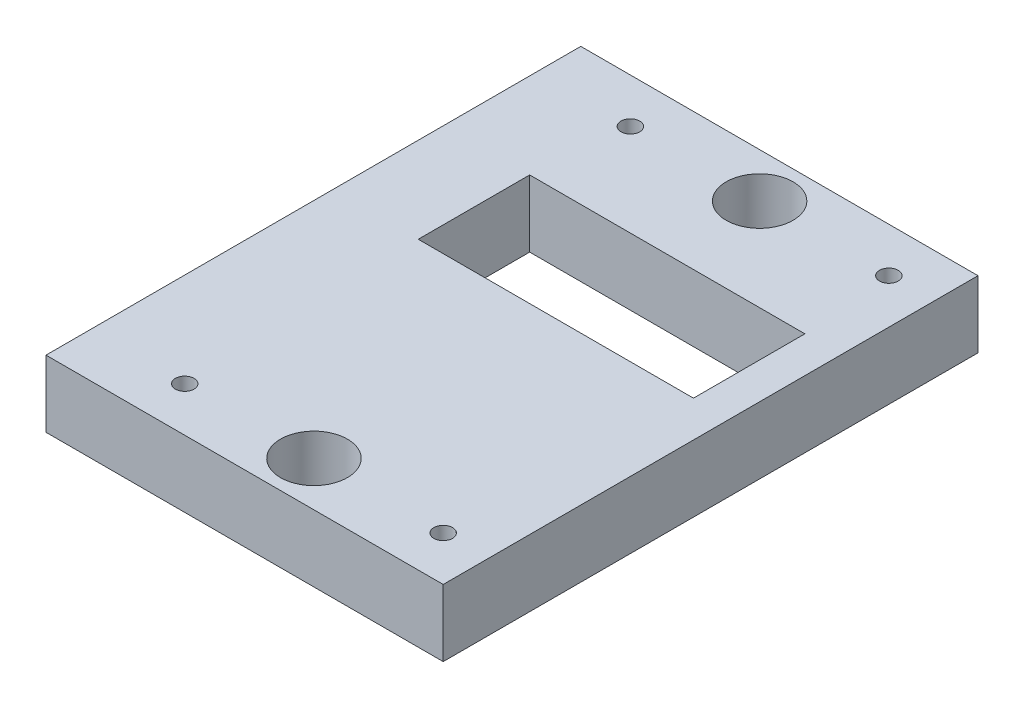
ISO-10303-21;
HEADER;
FILE_DESCRIPTION(('STEP AP214'),'2;1');
FILE_NAME('part.step','',(''),(''),'','','');
FILE_SCHEMA(('AUTOMOTIVE_DESIGN { 1 0 10303 214 1 1 1 1 }'));
ENDSEC;
DATA;
#1=APPLICATION_CONTEXT('core data for automotive mechanical design processes');
#2=APPLICATION_PROTOCOL_DEFINITION('international standard','automotive_design',2000,#1);
#3=PRODUCT_CONTEXT('',#1,'mechanical');
#4=PRODUCT('Part','Part','',(#3));
#5=PRODUCT_RELATED_PRODUCT_CATEGORY('part','',(#4));
#6=PRODUCT_DEFINITION_FORMATION('','',#4);
#7=PRODUCT_DEFINITION_CONTEXT('part definition',#1,'design');
#8=PRODUCT_DEFINITION('design','',#6,#7);
#9=PRODUCT_DEFINITION_SHAPE('','',#8);
#10=(LENGTH_UNIT() NAMED_UNIT(*) SI_UNIT(.MILLI.,.METRE.));
#11=(NAMED_UNIT(*) PLANE_ANGLE_UNIT() SI_UNIT($,.RADIAN.));
#12=(NAMED_UNIT(*) SI_UNIT($,.STERADIAN.) SOLID_ANGLE_UNIT());
#13=UNCERTAINTY_MEASURE_WITH_UNIT(LENGTH_MEASURE(1.E-05),#10,'distance_accuracy_value','');
#14=(GEOMETRIC_REPRESENTATION_CONTEXT(3) GLOBAL_UNCERTAINTY_ASSIGNED_CONTEXT((#13)) GLOBAL_UNIT_ASSIGNED_CONTEXT((#10,
#11,#12)) REPRESENTATION_CONTEXT('',''));
#15=CARTESIAN_POINT('',(0.,0.,0.));
#16=DIRECTION('',(0.,0.,1.));
#17=DIRECTION('',(1.,0.,0.));
#18=AXIS2_PLACEMENT_3D('',#15,#16,#17);
#19=CARTESIAN_POINT('',(-9.99999999999999,-7.5,110.));
#20=DIRECTION('',(0.,-1.,0.));
#21=DIRECTION('',(0.,0.,-1.));
#22=AXIS2_PLACEMENT_3D('',#19,#20,#21);
#23=CYLINDRICAL_SURFACE('',#22,2.09999999999999);
#24=CARTESIAN_POINT('',(-9.99999999999999,7.5,110.));
#25=DIRECTION('',(0.,-1.,0.));
#26=DIRECTION('',(0.,0.,-1.));
#27=AXIS2_PLACEMENT_3D('',#24,#25,#26);
#28=CIRCLE('',#27,2.1);
#29=CARTESIAN_POINT('',(-9.99999999999999,7.5,107.9));
#30=VERTEX_POINT('',#29);
#31=EDGE_CURVE('E202',#30,#30,#28,.T.);
#32=ORIENTED_EDGE('',*,*,#31,.F.);
#33=EDGE_LOOP('',(#32));
#34=FACE_BOUND('',#33,.T.);
#35=CARTESIAN_POINT('',(-9.99999999999999,-2.5,110.));
#36=DIRECTION('',(0.,-1.,0.));
#37=DIRECTION('',(0.,0.,-1.));
#38=AXIS2_PLACEMENT_3D('',#35,#36,#37);
#39=CIRCLE('',#38,2.09999999999999);
#40=CARTESIAN_POINT('',(-9.99999999999999,-2.5,107.9));
#41=VERTEX_POINT('',#40);
#42=EDGE_CURVE('E51',#41,#41,#39,.F.);
#43=ORIENTED_EDGE('',*,*,#42,.F.);
#44=EDGE_LOOP('',(#43));
#45=FACE_BOUND('',#44,.T.);
#46=ADVANCED_FACE('F47',(#34,#45),#23,.F.);
#47=CARTESIAN_POINT('',(-68.,-7.5,110.));
#48=DIRECTION('',(0.,-1.,0.));
#49=DIRECTION('',(0.,0.,-1.));
#50=AXIS2_PLACEMENT_3D('',#47,#48,#49);
#51=CYLINDRICAL_SURFACE('',#50,2.1);
#52=CARTESIAN_POINT('',(-68.,7.5,110.));
#53=DIRECTION('',(0.,-1.,0.));
#54=DIRECTION('',(0.,0.,-1.));
#55=AXIS2_PLACEMENT_3D('',#52,#53,#54);
#56=CIRCLE('',#55,2.1);
#57=CARTESIAN_POINT('',(-68.,7.5,107.9));
#58=VERTEX_POINT('',#57);
#59=EDGE_CURVE('E194',#58,#58,#56,.T.);
#60=ORIENTED_EDGE('',*,*,#59,.F.);
#61=EDGE_LOOP('',(#60));
#62=FACE_BOUND('',#61,.T.);
#63=CARTESIAN_POINT('',(-68.,-2.5,110.));
#64=DIRECTION('',(0.,-1.,0.));
#65=DIRECTION('',(0.,0.,-1.));
#66=AXIS2_PLACEMENT_3D('',#63,#64,#65);
#67=CIRCLE('',#66,2.1);
#68=CARTESIAN_POINT('',(-68.,-2.5,107.9));
#69=VERTEX_POINT('',#68);
#70=EDGE_CURVE('E180',#69,#69,#67,.F.);
#71=ORIENTED_EDGE('',*,*,#70,.F.);
#72=EDGE_LOOP('',(#71));
#73=FACE_BOUND('',#72,.T.);
#74=ADVANCED_FACE('F258',(#62,#73),#51,.F.);
#75=CARTESIAN_POINT('',(-68.,-7.5,10.));
#76=DIRECTION('',(0.,-1.,0.));
#77=DIRECTION('',(0.,0.,-1.));
#78=AXIS2_PLACEMENT_3D('',#75,#76,#77);
#79=CYLINDRICAL_SURFACE('',#78,2.1);
#80=CARTESIAN_POINT('',(-68.,7.5,10.));
#81=DIRECTION('',(0.,-1.,0.));
#82=DIRECTION('',(0.,0.,-1.));
#83=AXIS2_PLACEMENT_3D('',#80,#81,#82);
#84=CIRCLE('',#83,2.1);
#85=CARTESIAN_POINT('',(-68.,7.5,7.9));
#86=VERTEX_POINT('',#85);
#87=EDGE_CURVE('E189',#86,#86,#84,.T.);
#88=ORIENTED_EDGE('',*,*,#87,.F.);
#89=EDGE_LOOP('',(#88));
#90=FACE_BOUND('',#89,.T.);
#91=CARTESIAN_POINT('',(-68.,-2.5,10.));
#92=DIRECTION('',(0.,-1.,0.));
#93=DIRECTION('',(0.,0.,-1.));
#94=AXIS2_PLACEMENT_3D('',#91,#92,#93);
#95=CIRCLE('',#94,2.1);
#96=CARTESIAN_POINT('',(-68.,-2.5,7.9));
#97=VERTEX_POINT('',#96);
#98=EDGE_CURVE('E177',#97,#97,#95,.F.);
#99=ORIENTED_EDGE('',*,*,#98,.F.);
#100=EDGE_LOOP('',(#99));
#101=FACE_BOUND('',#100,.T.);
#102=ADVANCED_FACE('F264',(#90,#101),#79,.F.);
#103=CARTESIAN_POINT('',(-10.,-7.5,10.));
#104=DIRECTION('',(0.,-1.,0.));
#105=DIRECTION('',(0.,0.,-1.));
#106=AXIS2_PLACEMENT_3D('',#103,#104,#105);
#107=CYLINDRICAL_SURFACE('',#106,2.09999999999999);
#108=CARTESIAN_POINT('',(-10.,7.5,10.));
#109=DIRECTION('',(0.,-1.,0.));
#110=DIRECTION('',(0.,0.,-1.));
#111=AXIS2_PLACEMENT_3D('',#108,#109,#110);
#112=CIRCLE('',#111,2.1);
#113=CARTESIAN_POINT('',(-10.,7.5,7.9));
#114=VERTEX_POINT('',#113);
#115=EDGE_CURVE('E185',#114,#114,#112,.T.);
#116=ORIENTED_EDGE('',*,*,#115,.F.);
#117=EDGE_LOOP('',(#116));
#118=FACE_BOUND('',#117,.T.);
#119=CARTESIAN_POINT('',(-10.,-2.5,10.));
#120=DIRECTION('',(0.,-1.,0.));
#121=DIRECTION('',(0.,0.,-1.));
#122=AXIS2_PLACEMENT_3D('',#119,#120,#121);
#123=CIRCLE('',#122,2.09999999999999);
#124=CARTESIAN_POINT('',(-10.,-2.5,7.90000000000001));
#125=VERTEX_POINT('',#124);
#126=EDGE_CURVE('E174',#125,#125,#123,.F.);
#127=ORIENTED_EDGE('',*,*,#126,.F.);
#128=EDGE_LOOP('',(#127));
#129=FACE_BOUND('',#128,.T.);
#130=ADVANCED_FACE('F335',(#118,#129),#107,.F.);
#131=CARTESIAN_POINT('',(-89.125,7.5,120.));
#132=DIRECTION('',(1.,0.,0.));
#133=DIRECTION('',(0.,0.,-1.));
#134=AXIS2_PLACEMENT_3D('',#131,#132,#133);
#135=PLANE('',#134);
#136=DIRECTION('',(0.,0.,1.));
#137=VECTOR('',#136,1.);
#138=CARTESIAN_POINT('',(-89.125,-7.5,120.));
#139=LINE('',#138,#137);
#140=CARTESIAN_POINT('',(-89.125,-7.5,0.));
#141=VERTEX_POINT('',#140);
#142=CARTESIAN_POINT('',(-89.125,-7.5,120.));
#143=VERTEX_POINT('',#142);
#144=EDGE_CURVE('E120',#141,#143,#139,.T.);
#145=ORIENTED_EDGE('',*,*,#144,.T.);
#146=DIRECTION('',(0.,-1.,0.));
#147=VECTOR('',#146,1.);
#148=CARTESIAN_POINT('',(-89.125,7.5,120.));
#149=LINE('',#148,#147);
#150=CARTESIAN_POINT('',(-89.125,7.5,120.));
#151=VERTEX_POINT('',#150);
#152=EDGE_CURVE('E11',#151,#143,#149,.T.);
#153=ORIENTED_EDGE('',*,*,#152,.F.);
#154=DIRECTION('',(0.,0.,1.));
#155=VECTOR('',#154,1.);
#156=CARTESIAN_POINT('',(-89.125,7.5,120.));
#157=LINE('',#156,#155);
#158=CARTESIAN_POINT('',(-89.125,7.5,0.));
#159=VERTEX_POINT('',#158);
#160=EDGE_CURVE('E149',#159,#151,#157,.T.);
#161=ORIENTED_EDGE('',*,*,#160,.F.);
#162=DIRECTION('',(0.,-1.,0.));
#163=VECTOR('',#162,1.);
#164=CARTESIAN_POINT('',(-89.125,7.5,0.));
#165=LINE('',#164,#163);
#166=EDGE_CURVE('E159',#159,#141,#165,.T.);
#167=ORIENTED_EDGE('',*,*,#166,.T.);
#168=EDGE_LOOP('',(#145,#153,#161,#167));
#169=FACE_BOUND('',#168,.T.);
#170=ADVANCED_FACE('F49',(#169),#135,.F.);
#171=CARTESIAN_POINT('',(-89.125,7.5,120.));
#172=DIRECTION('',(0.,0.,-1.));
#173=DIRECTION('',(-1.,0.,0.));
#174=AXIS2_PLACEMENT_3D('',#171,#172,#173);
#175=PLANE('',#174);
#176=DIRECTION('',(1.,0.,0.));
#177=VECTOR('',#176,1.);
#178=CARTESIAN_POINT('',(-89.125,-7.5,120.));
#179=LINE('',#178,#177);
#180=CARTESIAN_POINT('',(0.,-7.5,120.));
#181=VERTEX_POINT('',#180);
#182=EDGE_CURVE('E162',#143,#181,#179,.T.);
#183=ORIENTED_EDGE('',*,*,#182,.T.);
#184=DIRECTION('',(0.,-1.,0.));
#185=VECTOR('',#184,1.);
#186=CARTESIAN_POINT('',(0.,7.5,120.));
#187=LINE('',#186,#185);
#188=CARTESIAN_POINT('',(0.,7.5,120.));
#189=VERTEX_POINT('',#188);
#190=EDGE_CURVE('E56',#189,#181,#187,.T.);
#191=ORIENTED_EDGE('',*,*,#190,.F.);
#192=DIRECTION('',(1.,0.,0.));
#193=VECTOR('',#192,1.);
#194=CARTESIAN_POINT('',(-89.125,7.5,120.));
#195=LINE('',#194,#193);
#196=EDGE_CURVE('E152',#151,#189,#195,.T.);
#197=ORIENTED_EDGE('',*,*,#196,.F.);
#198=ORIENTED_EDGE('',*,*,#152,.T.);
#199=EDGE_LOOP('',(#183,#191,#197,#198));
#200=FACE_BOUND('',#199,.T.);
#201=ADVANCED_FACE('F237',(#200),#175,.F.);
#202=CARTESIAN_POINT('',(0.,7.5,120.));
#203=DIRECTION('',(-1.,0.,0.));
#204=DIRECTION('',(0.,0.,1.));
#205=AXIS2_PLACEMENT_3D('',#202,#203,#204);
#206=PLANE('',#205);
#207=DIRECTION('',(0.,0.,-1.));
#208=VECTOR('',#207,1.);
#209=CARTESIAN_POINT('',(0.,-7.5,120.));
#210=LINE('',#209,#208);
#211=CARTESIAN_POINT('',(0.,-7.5,0.));
#212=VERTEX_POINT('',#211);
#213=EDGE_CURVE('E164',#181,#212,#210,.T.);
#214=ORIENTED_EDGE('',*,*,#213,.T.);
#215=DIRECTION('',(0.,-1.,0.));
#216=VECTOR('',#215,1.);
#217=CARTESIAN_POINT('',(0.,7.5,0.));
#218=LINE('',#217,#216);
#219=CARTESIAN_POINT('',(0.,7.5,0.));
#220=VERTEX_POINT('',#219);
#221=EDGE_CURVE('E169',#220,#212,#218,.T.);
#222=ORIENTED_EDGE('',*,*,#221,.F.);
#223=DIRECTION('',(0.,0.,-1.));
#224=VECTOR('',#223,1.);
#225=CARTESIAN_POINT('',(0.,7.5,120.));
#226=LINE('',#225,#224);
#227=EDGE_CURVE('E155',#189,#220,#226,.T.);
#228=ORIENTED_EDGE('',*,*,#227,.F.);
#229=ORIENTED_EDGE('',*,*,#190,.T.);
#230=EDGE_LOOP('',(#214,#222,#228,#229));
#231=FACE_BOUND('',#230,.T.);
#232=ADVANCED_FACE('F242',(#231),#206,.F.);
#233=CARTESIAN_POINT('',(-89.125,7.5,0.));
#234=DIRECTION('',(0.,0.,1.));
#235=DIRECTION('',(1.,0.,0.));
#236=AXIS2_PLACEMENT_3D('',#233,#234,#235);
#237=PLANE('',#236);
#238=DIRECTION('',(-1.,0.,0.));
#239=VECTOR('',#238,1.);
#240=CARTESIAN_POINT('',(-89.125,-7.5,0.));
#241=LINE('',#240,#239);
#242=EDGE_CURVE('E153',#212,#141,#241,.T.);
#243=ORIENTED_EDGE('',*,*,#242,.T.);
#244=ORIENTED_EDGE('',*,*,#166,.F.);
#245=DIRECTION('',(-1.,0.,0.));
#246=VECTOR('',#245,1.);
#247=CARTESIAN_POINT('',(-89.125,7.5,0.));
#248=LINE('',#247,#246);
#249=EDGE_CURVE('E157',#220,#159,#248,.T.);
#250=ORIENTED_EDGE('',*,*,#249,.F.);
#251=ORIENTED_EDGE('',*,*,#221,.T.);
#252=EDGE_LOOP('',(#243,#244,#250,#251));
#253=FACE_BOUND('',#252,.T.);
#254=ADVANCED_FACE('F227',(#253),#237,.F.);
#255=CARTESIAN_POINT('',(0.,7.5,0.));
#256=DIRECTION('',(0.,-1.,0.));
#257=DIRECTION('',(0.,0.,-1.));
#258=AXIS2_PLACEMENT_3D('',#255,#256,#257);
#259=PLANE('',#258);
#260=ORIENTED_EDGE('',*,*,#115,.T.);
#261=EDGE_LOOP('',(#260));
#262=FACE_BOUND('',#261,.T.);
#263=ORIENTED_EDGE('',*,*,#87,.T.);
#264=EDGE_LOOP('',(#263));
#265=FACE_BOUND('',#264,.T.);
#266=ORIENTED_EDGE('',*,*,#59,.T.);
#267=EDGE_LOOP('',(#266));
#268=FACE_BOUND('',#267,.T.);
#269=ORIENTED_EDGE('',*,*,#31,.T.);
#270=EDGE_LOOP('',(#269));
#271=FACE_BOUND('',#270,.T.);
#272=CARTESIAN_POINT('',(-39.,7.5,10.));
#273=DIRECTION('',(0.,1.,0.));
#274=DIRECTION('',(0.,0.,1.));
#275=AXIS2_PLACEMENT_3D('',#272,#273,#274);
#276=CIRCLE('',#275,7.5);
#277=CARTESIAN_POINT('',(-39.,7.5,17.5));
#278=VERTEX_POINT('',#277);
#279=EDGE_CURVE('E206',#278,#278,#276,.T.);
#280=ORIENTED_EDGE('',*,*,#279,.F.);
#281=EDGE_LOOP('',(#280));
#282=FACE_BOUND('',#281,.T.);
#283=CARTESIAN_POINT('',(-39.,7.5,110.));
#284=DIRECTION('',(0.,1.,0.));
#285=DIRECTION('',(0.,0.,1.));
#286=AXIS2_PLACEMENT_3D('',#283,#284,#285);
#287=CIRCLE('',#286,7.50000000000001);
#288=CARTESIAN_POINT('',(-39.,7.5,117.5));
#289=VERTEX_POINT('',#288);
#290=EDGE_CURVE('E205',#289,#289,#287,.T.);
#291=ORIENTED_EDGE('',*,*,#290,.F.);
#292=EDGE_LOOP('',(#291));
#293=FACE_BOUND('',#292,.T.);
#294=DIRECTION('',(1.,0.,0.));
#295=VECTOR('',#294,1.);
#296=CARTESIAN_POINT('',(-69.875,7.5,55.72));
#297=LINE('',#296,#295);
#298=CARTESIAN_POINT('',(-69.875,7.5,55.72));
#299=VERTEX_POINT('',#298);
#300=CARTESIAN_POINT('',(-8.12500000000002,7.5,55.72));
#301=VERTEX_POINT('',#300);
#302=EDGE_CURVE('E133',#299,#301,#297,.T.);
#303=ORIENTED_EDGE('',*,*,#302,.F.);
#304=DIRECTION('',(0.,0.,1.));
#305=VECTOR('',#304,1.);
#306=CARTESIAN_POINT('',(-69.875,7.5,30.72));
#307=LINE('',#306,#305);
#308=CARTESIAN_POINT('',(-69.875,7.5,30.72));
#309=VERTEX_POINT('',#308);
#310=EDGE_CURVE('E64',#309,#299,#307,.T.);
#311=ORIENTED_EDGE('',*,*,#310,.F.);
#312=DIRECTION('',(-1.,0.,0.));
#313=VECTOR('',#312,1.);
#314=CARTESIAN_POINT('',(-69.875,7.5,30.72));
#315=LINE('',#314,#313);
#316=CARTESIAN_POINT('',(-8.12500000000002,7.5,30.72));
#317=VERTEX_POINT('',#316);
#318=EDGE_CURVE('E126',#317,#309,#315,.T.);
#319=ORIENTED_EDGE('',*,*,#318,.F.);
#320=DIRECTION('',(0.,0.,-1.));
#321=VECTOR('',#320,1.);
#322=CARTESIAN_POINT('',(-8.12500000000002,7.5,30.72));
#323=LINE('',#322,#321);
#324=EDGE_CURVE('E140',#301,#317,#323,.T.);
#325=ORIENTED_EDGE('',*,*,#324,.F.);
#326=EDGE_LOOP('',(#303,#311,#319,#325));
#327=FACE_BOUND('',#326,.T.);
#328=ORIENTED_EDGE('',*,*,#160,.T.);
#329=ORIENTED_EDGE('',*,*,#196,.T.);
#330=ORIENTED_EDGE('',*,*,#227,.T.);
#331=ORIENTED_EDGE('',*,*,#249,.T.);
#332=EDGE_LOOP('',(#328,#329,#330,#331));
#333=FACE_BOUND('',#332,.T.);
#334=ADVANCED_FACE('F224',(#262,#265,#268,#271,#282,#293,#327,#333),#259,.F.);
#335=CARTESIAN_POINT('',(0.,-7.5,0.));
#336=DIRECTION('',(0.,-1.,0.));
#337=DIRECTION('',(0.,0.,-1.));
#338=AXIS2_PLACEMENT_3D('',#335,#336,#337);
#339=PLANE('',#338);
#340=CARTESIAN_POINT('',(-9.99999999999999,-7.5,110.));
#341=DIRECTION('',(0.,-1.,0.));
#342=DIRECTION('',(0.,0.,-1.));
#343=AXIS2_PLACEMENT_3D('',#340,#341,#342);
#344=CIRCLE('',#343,6.25);
#345=CARTESIAN_POINT('',(-9.99999999999999,-7.5,103.75));
#346=VERTEX_POINT('',#345);
#347=EDGE_CURVE('E446',#346,#346,#344,.T.);
#348=ORIENTED_EDGE('',*,*,#347,.F.);
#349=EDGE_LOOP('',(#348));
#350=FACE_BOUND('',#349,.T.);
#351=CARTESIAN_POINT('',(-68.,-7.5,10.));
#352=DIRECTION('',(0.,-1.,0.));
#353=DIRECTION('',(0.,0.,-1.));
#354=AXIS2_PLACEMENT_3D('',#351,#352,#353);
#355=CIRCLE('',#354,6.25000000000001);
#356=CARTESIAN_POINT('',(-68.,-7.5,3.74999999999999));
#357=VERTEX_POINT('',#356);
#358=EDGE_CURVE('E449',#357,#357,#355,.T.);
#359=ORIENTED_EDGE('',*,*,#358,.F.);
#360=EDGE_LOOP('',(#359));
#361=FACE_BOUND('',#360,.T.);
#362=CARTESIAN_POINT('',(-10.,-7.5,10.));
#363=DIRECTION('',(0.,-1.,0.));
#364=DIRECTION('',(0.,0.,-1.));
#365=AXIS2_PLACEMENT_3D('',#362,#363,#364);
#366=CIRCLE('',#365,6.25);
#367=CARTESIAN_POINT('',(-10.,-7.5,3.75));
#368=VERTEX_POINT('',#367);
#369=EDGE_CURVE('E459',#368,#368,#366,.T.);
#370=ORIENTED_EDGE('',*,*,#369,.F.);
#371=EDGE_LOOP('',(#370));
#372=FACE_BOUND('',#371,.T.);
#373=CARTESIAN_POINT('',(-68.,-7.5,110.));
#374=DIRECTION('',(0.,-1.,0.));
#375=DIRECTION('',(0.,0.,-1.));
#376=AXIS2_PLACEMENT_3D('',#373,#374,#375);
#377=CIRCLE('',#376,6.25000000000001);
#378=CARTESIAN_POINT('',(-68.,-7.5,103.75));
#379=VERTEX_POINT('',#378);
#380=EDGE_CURVE('E197',#379,#379,#377,.T.);
#381=ORIENTED_EDGE('',*,*,#380,.F.);
#382=EDGE_LOOP('',(#381));
#383=FACE_BOUND('',#382,.T.);
#384=CARTESIAN_POINT('',(-39.,-7.5,10.));
#385=DIRECTION('',(0.,-1.,0.));
#386=DIRECTION('',(0.,0.,-1.));
#387=AXIS2_PLACEMENT_3D('',#384,#385,#386);
#388=CIRCLE('',#387,7.5);
#389=CARTESIAN_POINT('',(-39.,-7.5,2.5));
#390=VERTEX_POINT('',#389);
#391=EDGE_CURVE('E209',#390,#390,#388,.F.);
#392=ORIENTED_EDGE('',*,*,#391,.T.);
#393=EDGE_LOOP('',(#392));
#394=FACE_BOUND('',#393,.T.);
#395=CARTESIAN_POINT('',(-39.,-7.5,110.));
#396=DIRECTION('',(0.,-1.,0.));
#397=DIRECTION('',(0.,0.,-1.));
#398=AXIS2_PLACEMENT_3D('',#395,#396,#397);
#399=CIRCLE('',#398,7.50000000000001);
#400=CARTESIAN_POINT('',(-39.,-7.5,102.5));
#401=VERTEX_POINT('',#400);
#402=EDGE_CURVE('E212',#401,#401,#399,.F.);
#403=ORIENTED_EDGE('',*,*,#402,.T.);
#404=EDGE_LOOP('',(#403));
#405=FACE_BOUND('',#404,.T.);
#406=DIRECTION('',(0.,0.,1.));
#407=VECTOR('',#406,1.);
#408=CARTESIAN_POINT('',(-69.875,-7.5,30.72));
#409=LINE('',#408,#407);
#410=CARTESIAN_POINT('',(-69.875,-7.5,30.72));
#411=VERTEX_POINT('',#410);
#412=CARTESIAN_POINT('',(-69.875,-7.5,55.72));
#413=VERTEX_POINT('',#412);
#414=EDGE_CURVE('E124',#411,#413,#409,.T.);
#415=ORIENTED_EDGE('',*,*,#414,.T.);
#416=DIRECTION('',(1.,0.,0.));
#417=VECTOR('',#416,1.);
#418=CARTESIAN_POINT('',(-69.875,-7.5,55.72));
#419=LINE('',#418,#417);
#420=CARTESIAN_POINT('',(-8.12500000000002,-7.5,55.72));
#421=VERTEX_POINT('',#420);
#422=EDGE_CURVE('E113',#413,#421,#419,.T.);
#423=ORIENTED_EDGE('',*,*,#422,.T.);
#424=DIRECTION('',(0.,0.,-1.));
#425=VECTOR('',#424,1.);
#426=CARTESIAN_POINT('',(-8.12500000000002,-7.5,30.72));
#427=LINE('',#426,#425);
#428=CARTESIAN_POINT('',(-8.12500000000002,-7.5,30.72));
#429=VERTEX_POINT('',#428);
#430=EDGE_CURVE('E135',#421,#429,#427,.T.);
#431=ORIENTED_EDGE('',*,*,#430,.T.);
#432=DIRECTION('',(-1.,0.,0.));
#433=VECTOR('',#432,1.);
#434=CARTESIAN_POINT('',(-69.875,-7.5,30.72));
#435=LINE('',#434,#433);
#436=EDGE_CURVE('E131',#429,#411,#435,.T.);
#437=ORIENTED_EDGE('',*,*,#436,.T.);
#438=EDGE_LOOP('',(#415,#423,#431,#437));
#439=FACE_BOUND('',#438,.T.);
#440=ORIENTED_EDGE('',*,*,#144,.F.);
#441=ORIENTED_EDGE('',*,*,#242,.F.);
#442=ORIENTED_EDGE('',*,*,#213,.F.);
#443=ORIENTED_EDGE('',*,*,#182,.F.);
#444=EDGE_LOOP('',(#440,#441,#442,#443));
#445=FACE_BOUND('',#444,.T.);
#446=ADVANCED_FACE('F129',(#350,#361,#372,#383,#394,#405,#439,#445),#339,.T.);
#447=CARTESIAN_POINT('',(-69.875,-7.501,30.72));
#448=DIRECTION('',(-1.,0.,0.));
#449=DIRECTION('',(0.,0.,1.));
#450=AXIS2_PLACEMENT_3D('',#447,#448,#449);
#451=PLANE('',#450);
#452=DIRECTION('',(0.,1.,0.));
#453=VECTOR('',#452,1.);
#454=CARTESIAN_POINT('',(-69.875,-7.501,30.72));
#455=LINE('',#454,#453);
#456=EDGE_CURVE('E121',#411,#309,#455,.T.);
#457=ORIENTED_EDGE('',*,*,#456,.T.);
#458=ORIENTED_EDGE('',*,*,#310,.T.);
#459=DIRECTION('',(0.,1.,0.));
#460=VECTOR('',#459,1.);
#461=CARTESIAN_POINT('',(-69.875,-7.501,55.72));
#462=LINE('',#461,#460);
#463=EDGE_CURVE('E115',#413,#299,#462,.T.);
#464=ORIENTED_EDGE('',*,*,#463,.F.);
#465=ORIENTED_EDGE('',*,*,#414,.F.);
#466=EDGE_LOOP('',(#457,#458,#464,#465));
#467=FACE_BOUND('',#466,.T.);
#468=ADVANCED_FACE('F123',(#467),#451,.F.);
#469=CARTESIAN_POINT('',(-69.875,-7.501,30.72));
#470=DIRECTION('',(0.,0.,-1.));
#471=DIRECTION('',(-1.,0.,0.));
#472=AXIS2_PLACEMENT_3D('',#469,#470,#471);
#473=PLANE('',#472);
#474=DIRECTION('',(0.,1.,0.));
#475=VECTOR('',#474,1.);
#476=CARTESIAN_POINT('',(-8.12500000000002,-7.501,30.72));
#477=LINE('',#476,#475);
#478=EDGE_CURVE('E146',#429,#317,#477,.T.);
#479=ORIENTED_EDGE('',*,*,#478,.T.);
#480=ORIENTED_EDGE('',*,*,#318,.T.);
#481=ORIENTED_EDGE('',*,*,#456,.F.);
#482=ORIENTED_EDGE('',*,*,#436,.F.);
#483=EDGE_LOOP('',(#479,#480,#481,#482));
#484=FACE_BOUND('',#483,.T.);
#485=ADVANCED_FACE('F222',(#484),#473,.F.);
#486=CARTESIAN_POINT('',(-8.12500000000002,-7.501,30.72));
#487=DIRECTION('',(1.,0.,0.));
#488=DIRECTION('',(0.,0.,-1.));
#489=AXIS2_PLACEMENT_3D('',#486,#487,#488);
#490=PLANE('',#489);
#491=DIRECTION('',(0.,1.,0.));
#492=VECTOR('',#491,1.);
#493=CARTESIAN_POINT('',(-8.12500000000002,-7.501,55.72));
#494=LINE('',#493,#492);
#495=EDGE_CURVE('E72',#421,#301,#494,.T.);
#496=ORIENTED_EDGE('',*,*,#495,.T.);
#497=ORIENTED_EDGE('',*,*,#324,.T.);
#498=ORIENTED_EDGE('',*,*,#478,.F.);
#499=ORIENTED_EDGE('',*,*,#430,.F.);
#500=EDGE_LOOP('',(#496,#497,#498,#499));
#501=FACE_BOUND('',#500,.T.);
#502=ADVANCED_FACE('F218',(#501),#490,.F.);
#503=CARTESIAN_POINT('',(-69.875,-7.501,55.72));
#504=DIRECTION('',(0.,0.,1.));
#505=DIRECTION('',(1.,0.,0.));
#506=AXIS2_PLACEMENT_3D('',#503,#504,#505);
#507=PLANE('',#506);
#508=ORIENTED_EDGE('',*,*,#463,.T.);
#509=ORIENTED_EDGE('',*,*,#302,.T.);
#510=ORIENTED_EDGE('',*,*,#495,.F.);
#511=ORIENTED_EDGE('',*,*,#422,.F.);
#512=EDGE_LOOP('',(#508,#509,#510,#511));
#513=FACE_BOUND('',#512,.T.);
#514=ADVANCED_FACE('F114',(#513),#507,.F.);
#515=CARTESIAN_POINT('',(-39.,-7.501,110.));
#516=DIRECTION('',(0.,1.,0.));
#517=DIRECTION('',(0.,0.,1.));
#518=AXIS2_PLACEMENT_3D('',#515,#516,#517);
#519=CYLINDRICAL_SURFACE('',#518,7.50000000000001);
#520=ORIENTED_EDGE('',*,*,#402,.F.);
#521=EDGE_LOOP('',(#520));
#522=FACE_BOUND('',#521,.T.);
#523=ORIENTED_EDGE('',*,*,#290,.T.);
#524=EDGE_LOOP('',(#523));
#525=FACE_BOUND('',#524,.T.);
#526=ADVANCED_FACE('F275',(#522,#525),#519,.F.);
#527=CARTESIAN_POINT('',(-39.,-7.501,10.));
#528=DIRECTION('',(0.,1.,0.));
#529=DIRECTION('',(0.,0.,1.));
#530=AXIS2_PLACEMENT_3D('',#527,#528,#529);
#531=CYLINDRICAL_SURFACE('',#530,7.5);
#532=ORIENTED_EDGE('',*,*,#391,.F.);
#533=EDGE_LOOP('',(#532));
#534=FACE_BOUND('',#533,.T.);
#535=ORIENTED_EDGE('',*,*,#279,.T.);
#536=EDGE_LOOP('',(#535));
#537=FACE_BOUND('',#536,.T.);
#538=ADVANCED_FACE('F271',(#534,#537),#531,.F.);
#539=CARTESIAN_POINT('',(-10.,-2.5,10.));
#540=DIRECTION('',(0.,-1.,0.));
#541=DIRECTION('',(0.,0.,-1.));
#542=AXIS2_PLACEMENT_3D('',#539,#540,#541);
#543=PLANE('',#542);
#544=CARTESIAN_POINT('',(-10.,-2.5,10.));
#545=DIRECTION('',(0.,-1.,0.));
#546=DIRECTION('',(0.,0.,-1.));
#547=AXIS2_PLACEMENT_3D('',#544,#545,#546);
#548=CIRCLE('',#547,6.25);
#549=CARTESIAN_POINT('',(-10.,-2.5,3.75));
#550=VERTEX_POINT('',#549);
#551=EDGE_CURVE('E452',#550,#550,#548,.T.);
#552=ORIENTED_EDGE('',*,*,#551,.T.);
#553=EDGE_LOOP('',(#552));
#554=FACE_BOUND('',#553,.T.);
#555=ORIENTED_EDGE('',*,*,#126,.T.);
#556=EDGE_LOOP('',(#555));
#557=FACE_BOUND('',#556,.T.);
#558=ADVANCED_FACE('F274',(#554,#557),#543,.T.);
#559=CARTESIAN_POINT('',(-10.,-2.5,10.));
#560=DIRECTION('',(0.,-1.,0.));
#561=DIRECTION('',(0.,0.,-1.));
#562=AXIS2_PLACEMENT_3D('',#559,#560,#561);
#563=CYLINDRICAL_SURFACE('',#562,6.25);
#564=ORIENTED_EDGE('',*,*,#551,.F.);
#565=EDGE_LOOP('',(#564));
#566=FACE_BOUND('',#565,.T.);
#567=ORIENTED_EDGE('',*,*,#369,.T.);
#568=EDGE_LOOP('',(#567));
#569=FACE_BOUND('',#568,.T.);
#570=ADVANCED_FACE('F363',(#566,#569),#563,.F.);
#571=CARTESIAN_POINT('',(-68.,-2.5,10.));
#572=DIRECTION('',(0.,-1.,0.));
#573=DIRECTION('',(0.,0.,-1.));
#574=AXIS2_PLACEMENT_3D('',#571,#572,#573);
#575=PLANE('',#574);
#576=CARTESIAN_POINT('',(-68.,-2.5,10.));
#577=DIRECTION('',(0.,-1.,0.));
#578=DIRECTION('',(0.,0.,-1.));
#579=AXIS2_PLACEMENT_3D('',#576,#577,#578);
#580=CIRCLE('',#579,6.25000000000001);
#581=CARTESIAN_POINT('',(-68.,-2.5,3.74999999999999));
#582=VERTEX_POINT('',#581);
#583=EDGE_CURVE('E457',#582,#582,#580,.T.);
#584=ORIENTED_EDGE('',*,*,#583,.T.);
#585=EDGE_LOOP('',(#584));
#586=FACE_BOUND('',#585,.T.);
#587=ORIENTED_EDGE('',*,*,#98,.T.);
#588=EDGE_LOOP('',(#587));
#589=FACE_BOUND('',#588,.T.);
#590=ADVANCED_FACE('F372',(#586,#589),#575,.T.);
#591=CARTESIAN_POINT('',(-68.,-2.5,10.));
#592=DIRECTION('',(0.,-1.,0.));
#593=DIRECTION('',(0.,0.,-1.));
#594=AXIS2_PLACEMENT_3D('',#591,#592,#593);
#595=CYLINDRICAL_SURFACE('',#594,6.25000000000001);
#596=ORIENTED_EDGE('',*,*,#583,.F.);
#597=EDGE_LOOP('',(#596));
#598=FACE_BOUND('',#597,.T.);
#599=ORIENTED_EDGE('',*,*,#358,.T.);
#600=EDGE_LOOP('',(#599));
#601=FACE_BOUND('',#600,.T.);
#602=ADVANCED_FACE('F381',(#598,#601),#595,.F.);
#603=CARTESIAN_POINT('',(-68.,-2.5,110.));
#604=DIRECTION('',(0.,-1.,0.));
#605=DIRECTION('',(0.,0.,-1.));
#606=AXIS2_PLACEMENT_3D('',#603,#604,#605);
#607=PLANE('',#606);
#608=CARTESIAN_POINT('',(-68.,-2.5,110.));
#609=DIRECTION('',(0.,-1.,0.));
#610=DIRECTION('',(0.,0.,-1.));
#611=AXIS2_PLACEMENT_3D('',#608,#609,#610);
#612=CIRCLE('',#611,6.25000000000001);
#613=CARTESIAN_POINT('',(-68.,-2.5,103.75));
#614=VERTEX_POINT('',#613);
#615=EDGE_CURVE('E178',#614,#614,#612,.T.);
#616=ORIENTED_EDGE('',*,*,#615,.T.);
#617=EDGE_LOOP('',(#616));
#618=FACE_BOUND('',#617,.T.);
#619=ORIENTED_EDGE('',*,*,#70,.T.);
#620=EDGE_LOOP('',(#619));
#621=FACE_BOUND('',#620,.T.);
#622=ADVANCED_FACE('F391',(#618,#621),#607,.T.);
#623=CARTESIAN_POINT('',(-68.,-2.5,110.));
#624=DIRECTION('',(0.,-1.,0.));
#625=DIRECTION('',(0.,0.,-1.));
#626=AXIS2_PLACEMENT_3D('',#623,#624,#625);
#627=CYLINDRICAL_SURFACE('',#626,6.25000000000001);
#628=ORIENTED_EDGE('',*,*,#615,.F.);
#629=EDGE_LOOP('',(#628));
#630=FACE_BOUND('',#629,.T.);
#631=ORIENTED_EDGE('',*,*,#380,.T.);
#632=EDGE_LOOP('',(#631));
#633=FACE_BOUND('',#632,.T.);
#634=ADVANCED_FACE('F400',(#630,#633),#627,.F.);
#635=CARTESIAN_POINT('',(-9.99999999999999,-2.5,110.));
#636=DIRECTION('',(0.,-1.,0.));
#637=DIRECTION('',(0.,0.,-1.));
#638=AXIS2_PLACEMENT_3D('',#635,#636,#637);
#639=PLANE('',#638);
#640=CARTESIAN_POINT('',(-9.99999999999999,-2.5,110.));
#641=DIRECTION('',(0.,-1.,0.));
#642=DIRECTION('',(0.,0.,-1.));
#643=AXIS2_PLACEMENT_3D('',#640,#641,#642);
#644=CIRCLE('',#643,6.25);
#645=CARTESIAN_POINT('',(-9.99999999999999,-2.5,103.75));
#646=VERTEX_POINT('',#645);
#647=EDGE_CURVE('E444',#646,#646,#644,.T.);
#648=ORIENTED_EDGE('',*,*,#647,.T.);
#649=EDGE_LOOP('',(#648));
#650=FACE_BOUND('',#649,.T.);
#651=ORIENTED_EDGE('',*,*,#42,.T.);
#652=EDGE_LOOP('',(#651));
#653=FACE_BOUND('',#652,.T.);
#654=ADVANCED_FACE('F410',(#650,#653),#639,.T.);
#655=CARTESIAN_POINT('',(-9.99999999999999,-2.5,110.));
#656=DIRECTION('',(0.,-1.,0.));
#657=DIRECTION('',(0.,0.,-1.));
#658=AXIS2_PLACEMENT_3D('',#655,#656,#657);
#659=CYLINDRICAL_SURFACE('',#658,6.25);
#660=ORIENTED_EDGE('',*,*,#647,.F.);
#661=EDGE_LOOP('',(#660));
#662=FACE_BOUND('',#661,.T.);
#663=ORIENTED_EDGE('',*,*,#347,.T.);
#664=EDGE_LOOP('',(#663));
#665=FACE_BOUND('',#664,.T.);
#666=ADVANCED_FACE('F419',(#662,#665),#659,.F.);
#667=CLOSED_SHELL('',(#46,#74,#102,#130,#170,#201,#232,#254,#334,#446,#468,#485,#502,#514,#526,
#538,#558,#570,#590,#602,#622,#634,#654,#666));
#668=MANIFOLD_SOLID_BREP('B2',#667);
#669=ADVANCED_BREP_SHAPE_REPRESENTATION('',(#18,#668),#14);
#670=SHAPE_DEFINITION_REPRESENTATION(#9,#669);
ENDSEC;
END-ISO-10303-21;
